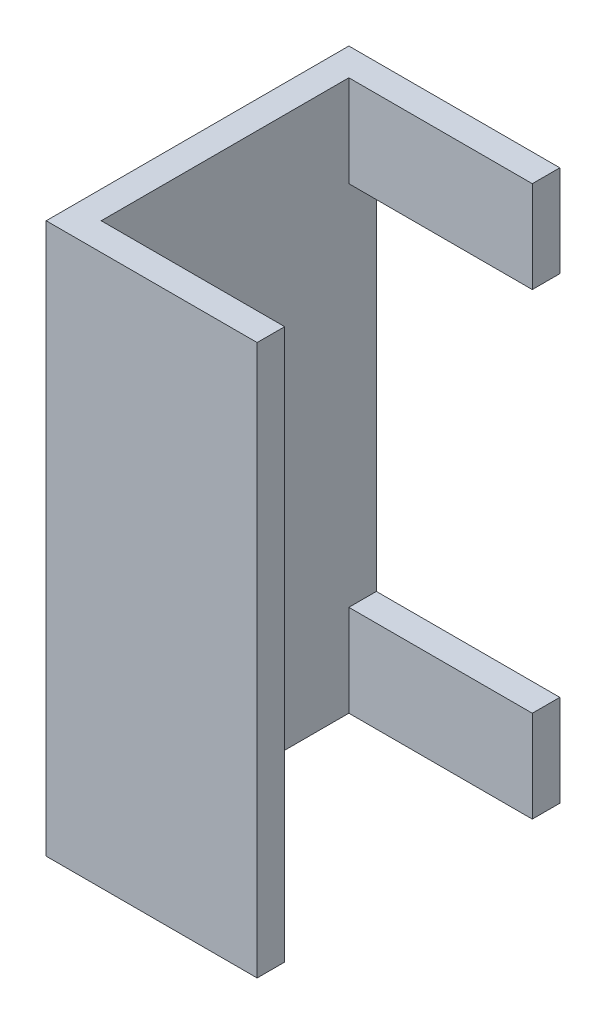
ISO-10303-21;
HEADER;
FILE_DESCRIPTION(('STEP AP214'),'2;1');
FILE_NAME('part.step','',(''),(''),'','','');
FILE_SCHEMA(('AUTOMOTIVE_DESIGN { 1 0 10303 214 1 1 1 1 }'));
ENDSEC;
DATA;
#1=APPLICATION_CONTEXT('core data for automotive mechanical design processes');
#2=APPLICATION_PROTOCOL_DEFINITION('international standard','automotive_design',2000,#1);
#3=PRODUCT_CONTEXT('',#1,'mechanical');
#4=PRODUCT('Part','Part','',(#3));
#5=PRODUCT_RELATED_PRODUCT_CATEGORY('part','',(#4));
#6=PRODUCT_DEFINITION_FORMATION('','',#4);
#7=PRODUCT_DEFINITION_CONTEXT('part definition',#1,'design');
#8=PRODUCT_DEFINITION('design','',#6,#7);
#9=PRODUCT_DEFINITION_SHAPE('','',#8);
#10=(LENGTH_UNIT() NAMED_UNIT(*) SI_UNIT(.MILLI.,.METRE.));
#11=(NAMED_UNIT(*) PLANE_ANGLE_UNIT() SI_UNIT($,.RADIAN.));
#12=(NAMED_UNIT(*) SI_UNIT($,.STERADIAN.) SOLID_ANGLE_UNIT());
#13=UNCERTAINTY_MEASURE_WITH_UNIT(LENGTH_MEASURE(1.E-05),#10,'distance_accuracy_value','');
#14=(GEOMETRIC_REPRESENTATION_CONTEXT(3) GLOBAL_UNCERTAINTY_ASSIGNED_CONTEXT((#13)) GLOBAL_UNIT_ASSIGNED_CONTEXT((#10,
#11,#12)) REPRESENTATION_CONTEXT('',''));
#15=CARTESIAN_POINT('',(0.,0.,0.));
#16=DIRECTION('',(0.,0.,1.));
#17=DIRECTION('',(1.,0.,0.));
#18=AXIS2_PLACEMENT_3D('',#15,#16,#17);
#19=CARTESIAN_POINT('',(-41.0585778341793,-41.0218663170366,36.));
#20=DIRECTION('',(1.,0.,0.));
#21=DIRECTION('',(0.,1.,0.));
#22=AXIS2_PLACEMENT_3D('',#19,#20,#21);
#23=PLANE('',#22);
#24=DIRECTION('',(0.,0.,1.));
#25=VECTOR('',#24,1.);
#26=CARTESIAN_POINT('',(-41.0585778341793,39.1000012156805,3.));
#27=LINE('',#26,#25);
#28=CARTESIAN_POINT('',(-41.0585778341793,39.1000012156805,3.));
#29=VERTEX_POINT('',#28);
#30=CARTESIAN_POINT('',(-41.0585778341793,39.1000012156805,30.));
#31=VERTEX_POINT('',#30);
#32=EDGE_CURVE('E56',#29,#31,#27,.T.);
#33=ORIENTED_EDGE('',*,*,#32,.T.);
#34=DIRECTION('',(0.,1.,0.));
#35=VECTOR('',#34,1.);
#36=CARTESIAN_POINT('',(-41.0585778341794,39.1000012156805,30.));
#37=LINE('',#36,#35);
#38=CARTESIAN_POINT('',(-41.0585778341793,-20.8999987843195,30.));
#39=VERTEX_POINT('',#38);
#40=EDGE_CURVE('E149',#39,#31,#37,.T.);
#41=ORIENTED_EDGE('',*,*,#40,.F.);
#42=DIRECTION('',(0.,0.,1.));
#43=VECTOR('',#42,1.);
#44=CARTESIAN_POINT('',(-41.0585778341793,-20.8999987843195,3.));
#45=LINE('',#44,#43);
#46=CARTESIAN_POINT('',(-41.0585778341793,-20.8999987843195,3.));
#47=VERTEX_POINT('',#46);
#48=EDGE_CURVE('E163',#47,#39,#45,.T.);
#49=ORIENTED_EDGE('',*,*,#48,.F.);
#50=DIRECTION('',(0.,-1.,0.));
#51=VECTOR('',#50,1.);
#52=CARTESIAN_POINT('',(-41.0585778341793,-10.8999987843195,3.));
#53=LINE('',#52,#51);
#54=CARTESIAN_POINT('',(-41.0585778341793,-10.8999987843195,3.));
#55=VERTEX_POINT('',#54);
#56=EDGE_CURVE('E153',#55,#47,#53,.T.);
#57=ORIENTED_EDGE('',*,*,#56,.F.);
#58=DIRECTION('',(0.,0.,-1.));
#59=VECTOR('',#58,1.);
#60=CARTESIAN_POINT('',(-41.0585778341793,-10.8999987843195,36.));
#61=LINE('',#60,#59);
#62=CARTESIAN_POINT('',(-41.0585778341793,-10.8999987843195,0.));
#63=VERTEX_POINT('',#62);
#64=EDGE_CURVE('E11',#55,#63,#61,.T.);
#65=ORIENTED_EDGE('',*,*,#64,.T.);
#66=DIRECTION('',(0.,-1.,0.));
#67=VECTOR('',#66,1.);
#68=CARTESIAN_POINT('',(-41.0585778341793,-41.0218663170366,0.));
#69=LINE('',#68,#67);
#70=CARTESIAN_POINT('',(-41.0585778341793,29.1000012156805,0.));
#71=VERTEX_POINT('',#70);
#72=EDGE_CURVE('E179',#71,#63,#69,.T.);
#73=ORIENTED_EDGE('',*,*,#72,.F.);
#74=DIRECTION('',(0.,0.,-1.));
#75=VECTOR('',#74,1.);
#76=CARTESIAN_POINT('',(-41.0585778341793,29.1000012156805,36.));
#77=LINE('',#76,#75);
#78=CARTESIAN_POINT('',(-41.0585778341793,29.1000012156805,3.));
#79=VERTEX_POINT('',#78);
#80=EDGE_CURVE('E41',#79,#71,#77,.T.);
#81=ORIENTED_EDGE('',*,*,#80,.F.);
#82=DIRECTION('',(0.,-1.,0.));
#83=VECTOR('',#82,1.);
#84=CARTESIAN_POINT('',(-41.0585778341793,39.1000012156805,3.));
#85=LINE('',#84,#83);
#86=EDGE_CURVE('E171',#29,#79,#85,.T.);
#87=ORIENTED_EDGE('',*,*,#86,.F.);
#88=EDGE_LOOP('',(#33,#41,#49,#57,#65,#73,#81,#87));
#89=FACE_BOUND('',#88,.T.);
#90=ADVANCED_FACE('F33',(#89),#23,.T.);
#91=CARTESIAN_POINT('',(-32.5585778341793,-10.8999987843195,36.));
#92=DIRECTION('',(0.,1.,0.));
#93=DIRECTION('',(-1.,0.,0.));
#94=AXIS2_PLACEMENT_3D('',#91,#92,#93);
#95=PLANE('',#94);
#96=ORIENTED_EDGE('',*,*,#64,.F.);
#97=DIRECTION('',(-1.,0.,0.));
#98=VECTOR('',#97,1.);
#99=CARTESIAN_POINT('',(-41.0585778341793,-10.8999987843195,3.));
#100=LINE('',#99,#98);
#101=CARTESIAN_POINT('',(-21.0585778341793,-10.8999987843195,3.));
#102=VERTEX_POINT('',#101);
#103=EDGE_CURVE('E160',#102,#55,#100,.T.);
#104=ORIENTED_EDGE('',*,*,#103,.F.);
#105=DIRECTION('',(0.,0.,-1.));
#106=VECTOR('',#105,1.);
#107=CARTESIAN_POINT('',(-21.0585778341793,-10.8999987843195,36.));
#108=LINE('',#107,#106);
#109=CARTESIAN_POINT('',(-21.0585778341793,-10.8999987843195,0.));
#110=VERTEX_POINT('',#109);
#111=EDGE_CURVE('E198',#102,#110,#108,.T.);
#112=ORIENTED_EDGE('',*,*,#111,.T.);
#113=DIRECTION('',(1.,0.,0.));
#114=VECTOR('',#113,1.);
#115=CARTESIAN_POINT('',(-32.5585778341793,-10.8999987843195,0.));
#116=LINE('',#115,#114);
#117=EDGE_CURVE('E176',#63,#110,#116,.T.);
#118=ORIENTED_EDGE('',*,*,#117,.F.);
#119=EDGE_LOOP('',(#96,#104,#112,#118));
#120=FACE_BOUND('',#119,.T.);
#121=ADVANCED_FACE('F35',(#120),#95,.T.);
#122=CARTESIAN_POINT('',(-21.0585778341793,-41.0218663170366,36.));
#123=DIRECTION('',(1.,0.,0.));
#124=DIRECTION('',(0.,1.,0.));
#125=AXIS2_PLACEMENT_3D('',#122,#123,#124);
#126=PLANE('',#125);
#127=ORIENTED_EDGE('',*,*,#111,.F.);
#128=DIRECTION('',(0.,1.,0.));
#129=VECTOR('',#128,1.);
#130=CARTESIAN_POINT('',(-21.0585778341793,-10.8999987843195,3.));
#131=LINE('',#130,#129);
#132=CARTESIAN_POINT('',(-21.0585778341793,-20.8999987843195,3.));
#133=VERTEX_POINT('',#132);
#134=EDGE_CURVE('E158',#133,#102,#131,.T.);
#135=ORIENTED_EDGE('',*,*,#134,.F.);
#136=DIRECTION('',(0.,0.,-1.));
#137=VECTOR('',#136,1.);
#138=CARTESIAN_POINT('',(-21.0585778341793,-20.8999987843195,36.));
#139=LINE('',#138,#137);
#140=CARTESIAN_POINT('',(-21.0585778341793,-20.8999987843195,0.));
#141=VERTEX_POINT('',#140);
#142=EDGE_CURVE('E200',#133,#141,#139,.T.);
#143=ORIENTED_EDGE('',*,*,#142,.T.);
#144=DIRECTION('',(0.,-1.,0.));
#145=VECTOR('',#144,1.);
#146=CARTESIAN_POINT('',(-21.0585778341793,-41.0218663170366,0.));
#147=LINE('',#146,#145);
#148=EDGE_CURVE('E189',#110,#141,#147,.T.);
#149=ORIENTED_EDGE('',*,*,#148,.F.);
#150=EDGE_LOOP('',(#127,#135,#143,#149));
#151=FACE_BOUND('',#150,.T.);
#152=ADVANCED_FACE('F227',(#151),#126,.T.);
#153=CARTESIAN_POINT('',(-32.5585778341793,29.1000012156805,36.));
#154=DIRECTION('',(0.,1.,0.));
#155=DIRECTION('',(0.,0.,1.));
#156=AXIS2_PLACEMENT_3D('',#153,#154,#155);
#157=PLANE('',#156);
#158=DIRECTION('',(0.,0.,-1.));
#159=VECTOR('',#158,1.);
#160=CARTESIAN_POINT('',(-21.0585778341794,29.1000012156805,36.));
#161=LINE('',#160,#159);
#162=CARTESIAN_POINT('',(-21.0585778341794,29.1000012156805,3.));
#163=VERTEX_POINT('',#162);
#164=CARTESIAN_POINT('',(-21.0585778341794,29.1000012156805,0.));
#165=VERTEX_POINT('',#164);
#166=EDGE_CURVE('E207',#163,#165,#161,.T.);
#167=ORIENTED_EDGE('',*,*,#166,.F.);
#168=DIRECTION('',(1.,0.,0.));
#169=VECTOR('',#168,1.);
#170=CARTESIAN_POINT('',(-21.0585778341794,29.1000012156805,3.));
#171=LINE('',#170,#169);
#172=EDGE_CURVE('E173',#79,#163,#171,.T.);
#173=ORIENTED_EDGE('',*,*,#172,.F.);
#174=ORIENTED_EDGE('',*,*,#80,.T.);
#175=DIRECTION('',(1.,0.,0.));
#176=VECTOR('',#175,1.);
#177=CARTESIAN_POINT('',(-32.5585778341793,29.1000012156805,0.));
#178=LINE('',#177,#176);
#179=EDGE_CURVE('E182',#71,#165,#178,.T.);
#180=ORIENTED_EDGE('',*,*,#179,.T.);
#181=EDGE_LOOP('',(#167,#173,#174,#180));
#182=FACE_BOUND('',#181,.T.);
#183=ADVANCED_FACE('F213',(#182),#157,.F.);
#184=DIRECTION('',(0.,1.,0.));
#185=VECTOR('',#184,1.);
#186=CARTESIAN_POINT('',(-21.0585778341794,39.1000012156805,3.));
#187=LINE('',#186,#185);
#188=CARTESIAN_POINT('',(-21.0585778341794,39.1000012156805,3.));
#189=VERTEX_POINT('',#188);
#190=EDGE_CURVE('E166',#163,#189,#187,.T.);
#191=ORIENTED_EDGE('',*,*,#190,.F.);
#192=ORIENTED_EDGE('',*,*,#166,.T.);
#193=CARTESIAN_POINT('',(-21.0585778341794,39.1000012156805,0.));
#194=VERTEX_POINT('',#193);
#195=EDGE_CURVE('E185',#194,#165,#147,.T.);
#196=ORIENTED_EDGE('',*,*,#195,.F.);
#197=DIRECTION('',(0.,0.,-1.));
#198=VECTOR('',#197,1.);
#199=CARTESIAN_POINT('',(-21.0585778341794,39.1000012156805,36.));
#200=LINE('',#199,#198);
#201=EDGE_CURVE('E205',#189,#194,#200,.T.);
#202=ORIENTED_EDGE('',*,*,#201,.F.);
#203=EDGE_LOOP('',(#191,#192,#196,#202));
#204=FACE_BOUND('',#203,.T.);
#205=ADVANCED_FACE('F240',(#204),#126,.T.);
#206=CARTESIAN_POINT('',(-32.5585778341793,39.1000012156805,36.));
#207=DIRECTION('',(0.,1.,0.));
#208=DIRECTION('',(0.,0.,1.));
#209=AXIS2_PLACEMENT_3D('',#206,#207,#208);
#210=PLANE('',#209);
#211=DIRECTION('',(1.,0.,0.));
#212=VECTOR('',#211,1.);
#213=CARTESIAN_POINT('',(-71.0585778341793,39.1000012156805,33.));
#214=LINE('',#213,#212);
#215=CARTESIAN_POINT('',(-44.0585778341793,39.1000012156805,33.));
#216=VERTEX_POINT('',#215);
#217=CARTESIAN_POINT('',(-21.0585778341793,39.1000012156805,33.));
#218=VERTEX_POINT('',#217);
#219=EDGE_CURVE('E121',#216,#218,#214,.T.);
#220=ORIENTED_EDGE('',*,*,#219,.T.);
#221=DIRECTION('',(0.,0.,1.));
#222=VECTOR('',#221,1.);
#223=CARTESIAN_POINT('',(-21.0585778341793,39.1000012156805,36.));
#224=LINE('',#223,#222);
#225=CARTESIAN_POINT('',(-21.0585778341793,39.1000012156805,30.));
#226=VERTEX_POINT('',#225);
#227=EDGE_CURVE('E132',#226,#218,#224,.T.);
#228=ORIENTED_EDGE('',*,*,#227,.F.);
#229=DIRECTION('',(-1.,0.,0.));
#230=VECTOR('',#229,1.);
#231=CARTESIAN_POINT('',(-21.0585778341793,39.1000012156805,30.));
#232=LINE('',#231,#230);
#233=EDGE_CURVE('E141',#226,#31,#232,.T.);
#234=ORIENTED_EDGE('',*,*,#233,.T.);
#235=ORIENTED_EDGE('',*,*,#32,.F.);
#236=DIRECTION('',(-1.,0.,0.));
#237=VECTOR('',#236,1.);
#238=CARTESIAN_POINT('',(-21.0585778341794,39.1000012156805,3.));
#239=LINE('',#238,#237);
#240=EDGE_CURVE('E168',#189,#29,#239,.T.);
#241=ORIENTED_EDGE('',*,*,#240,.F.);
#242=ORIENTED_EDGE('',*,*,#201,.T.);
#243=DIRECTION('',(1.,0.,0.));
#244=VECTOR('',#243,1.);
#245=CARTESIAN_POINT('',(-32.5585778341793,39.1000012156805,0.));
#246=LINE('',#245,#244);
#247=CARTESIAN_POINT('',(-44.0585778341794,39.1000012156805,0.));
#248=VERTEX_POINT('',#247);
#249=EDGE_CURVE('E188',#248,#194,#246,.T.);
#250=ORIENTED_EDGE('',*,*,#249,.F.);
#251=DIRECTION('',(0.,0.,-1.));
#252=VECTOR('',#251,1.);
#253=CARTESIAN_POINT('',(-44.0585778341794,39.1000012156805,36.));
#254=LINE('',#253,#252);
#255=EDGE_CURVE('E134',#216,#248,#254,.T.);
#256=ORIENTED_EDGE('',*,*,#255,.F.);
#257=EDGE_LOOP('',(#220,#228,#234,#235,#241,#242,#250,#256));
#258=FACE_BOUND('',#257,.T.);
#259=ADVANCED_FACE('F130',(#258),#210,.T.);
#260=CARTESIAN_POINT('',(-44.0585778341793,-41.0218663170366,36.));
#261=DIRECTION('',(1.,0.,0.));
#262=DIRECTION('',(0.,1.,0.));
#263=AXIS2_PLACEMENT_3D('',#260,#261,#262);
#264=PLANE('',#263);
#265=DIRECTION('',(0.,0.,-1.));
#266=VECTOR('',#265,1.);
#267=CARTESIAN_POINT('',(-44.0585778341793,-20.8999987843195,36.));
#268=LINE('',#267,#266);
#269=CARTESIAN_POINT('',(-44.0585778341793,-20.8999987843195,33.));
#270=VERTEX_POINT('',#269);
#271=CARTESIAN_POINT('',(-44.0585778341793,-20.8999987843195,0.));
#272=VERTEX_POINT('',#271);
#273=EDGE_CURVE('E202',#270,#272,#268,.T.);
#274=ORIENTED_EDGE('',*,*,#273,.F.);
#275=DIRECTION('',(0.,1.,0.));
#276=VECTOR('',#275,1.);
#277=CARTESIAN_POINT('',(-44.0585778341793,-41.0218663170366,33.));
#278=LINE('',#277,#276);
#279=EDGE_CURVE('E135',#270,#216,#278,.T.);
#280=ORIENTED_EDGE('',*,*,#279,.T.);
#281=ORIENTED_EDGE('',*,*,#255,.T.);
#282=DIRECTION('',(0.,-1.,0.));
#283=VECTOR('',#282,1.);
#284=CARTESIAN_POINT('',(-44.0585778341793,-41.0218663170366,0.));
#285=LINE('',#284,#283);
#286=EDGE_CURVE('E192',#248,#272,#285,.T.);
#287=ORIENTED_EDGE('',*,*,#286,.T.);
#288=EDGE_LOOP('',(#274,#280,#281,#287));
#289=FACE_BOUND('',#288,.T.);
#290=ADVANCED_FACE('F265',(#289),#264,.F.);
#291=CARTESIAN_POINT('',(-32.5585778341793,-20.8999987843195,36.));
#292=DIRECTION('',(0.,1.,0.));
#293=DIRECTION('',(0.,0.,1.));
#294=AXIS2_PLACEMENT_3D('',#291,#292,#293);
#295=PLANE('',#294);
#296=DIRECTION('',(0.,0.,-1.));
#297=VECTOR('',#296,1.);
#298=CARTESIAN_POINT('',(-21.0585778341793,-20.8999987843195,36.));
#299=LINE('',#298,#297);
#300=CARTESIAN_POINT('',(-21.0585778341793,-20.8999987843195,33.));
#301=VERTEX_POINT('',#300);
#302=CARTESIAN_POINT('',(-21.0585778341793,-20.8999987843195,30.));
#303=VERTEX_POINT('',#302);
#304=EDGE_CURVE('E145',#301,#303,#299,.T.);
#305=ORIENTED_EDGE('',*,*,#304,.F.);
#306=DIRECTION('',(1.,0.,0.));
#307=VECTOR('',#306,1.);
#308=CARTESIAN_POINT('',(-71.0585778341793,-20.8999987843195,33.));
#309=LINE('',#308,#307);
#310=EDGE_CURVE('E48',#270,#301,#309,.T.);
#311=ORIENTED_EDGE('',*,*,#310,.F.);
#312=ORIENTED_EDGE('',*,*,#273,.T.);
#313=DIRECTION('',(1.,0.,0.));
#314=VECTOR('',#313,1.);
#315=CARTESIAN_POINT('',(-32.5585778341793,-20.8999987843195,0.));
#316=LINE('',#315,#314);
#317=EDGE_CURVE('E195',#272,#141,#316,.T.);
#318=ORIENTED_EDGE('',*,*,#317,.T.);
#319=ORIENTED_EDGE('',*,*,#142,.F.);
#320=DIRECTION('',(1.,0.,0.));
#321=VECTOR('',#320,1.);
#322=CARTESIAN_POINT('',(-41.0585778341793,-20.8999987843195,3.));
#323=LINE('',#322,#321);
#324=EDGE_CURVE('E156',#47,#133,#323,.T.);
#325=ORIENTED_EDGE('',*,*,#324,.F.);
#326=ORIENTED_EDGE('',*,*,#48,.T.);
#327=DIRECTION('',(-1.,0.,0.));
#328=VECTOR('',#327,1.);
#329=CARTESIAN_POINT('',(-21.0585778341793,-20.8999987843195,30.));
#330=LINE('',#329,#328);
#331=EDGE_CURVE('E143',#303,#39,#330,.T.);
#332=ORIENTED_EDGE('',*,*,#331,.F.);
#333=EDGE_LOOP('',(#305,#311,#312,#318,#319,#325,#326,#332));
#334=FACE_BOUND('',#333,.T.);
#335=ADVANCED_FACE('F232',(#334),#295,.F.);
#336=CARTESIAN_POINT('',(-32.5585778341793,-41.0218663170366,0.));
#337=DIRECTION('',(0.,0.,1.));
#338=DIRECTION('',(1.,0.,0.));
#339=AXIS2_PLACEMENT_3D('',#336,#337,#338);
#340=PLANE('',#339);
#341=ORIENTED_EDGE('',*,*,#117,.T.);
#342=ORIENTED_EDGE('',*,*,#148,.T.);
#343=ORIENTED_EDGE('',*,*,#317,.F.);
#344=ORIENTED_EDGE('',*,*,#286,.F.);
#345=ORIENTED_EDGE('',*,*,#249,.T.);
#346=ORIENTED_EDGE('',*,*,#195,.T.);
#347=ORIENTED_EDGE('',*,*,#179,.F.);
#348=ORIENTED_EDGE('',*,*,#72,.T.);
#349=EDGE_LOOP('',(#341,#342,#343,#344,#345,#346,#347,#348));
#350=FACE_BOUND('',#349,.T.);
#351=ADVANCED_FACE('F216',(#350),#340,.F.);
#352=CARTESIAN_POINT('',(-21.0585778341794,29.1000012156805,3.));
#353=DIRECTION('',(0.,0.,-1.));
#354=DIRECTION('',(-1.,0.,0.));
#355=AXIS2_PLACEMENT_3D('',#352,#353,#354);
#356=PLANE('',#355);
#357=ORIENTED_EDGE('',*,*,#190,.T.);
#358=ORIENTED_EDGE('',*,*,#240,.T.);
#359=ORIENTED_EDGE('',*,*,#86,.T.);
#360=ORIENTED_EDGE('',*,*,#172,.T.);
#361=EDGE_LOOP('',(#357,#358,#359,#360));
#362=FACE_BOUND('',#361,.T.);
#363=ADVANCED_FACE('F242',(#362),#356,.F.);
#364=CARTESIAN_POINT('',(-41.0585778341793,-20.8999987843195,3.));
#365=DIRECTION('',(0.,0.,1.));
#366=DIRECTION('',(1.,0.,0.));
#367=AXIS2_PLACEMENT_3D('',#364,#365,#366);
#368=PLANE('',#367);
#369=ORIENTED_EDGE('',*,*,#56,.T.);
#370=ORIENTED_EDGE('',*,*,#324,.T.);
#371=ORIENTED_EDGE('',*,*,#134,.T.);
#372=ORIENTED_EDGE('',*,*,#103,.T.);
#373=EDGE_LOOP('',(#369,#370,#371,#372));
#374=FACE_BOUND('',#373,.T.);
#375=ADVANCED_FACE('F247',(#374),#368,.T.);
#376=CARTESIAN_POINT('',(-21.0585778341793,39.1000012156805,30.));
#377=DIRECTION('',(0.,0.,1.));
#378=DIRECTION('',(0.,-1.,0.));
#379=AXIS2_PLACEMENT_3D('',#376,#377,#378);
#380=PLANE('',#379);
#381=ORIENTED_EDGE('',*,*,#40,.T.);
#382=ORIENTED_EDGE('',*,*,#233,.F.);
#383=DIRECTION('',(0.,1.,0.));
#384=VECTOR('',#383,1.);
#385=CARTESIAN_POINT('',(-21.0585778341793,39.1000012156805,30.));
#386=LINE('',#385,#384);
#387=EDGE_CURVE('E139',#303,#226,#386,.T.);
#388=ORIENTED_EDGE('',*,*,#387,.F.);
#389=ORIENTED_EDGE('',*,*,#331,.T.);
#390=EDGE_LOOP('',(#381,#382,#388,#389));
#391=FACE_BOUND('',#390,.T.);
#392=ADVANCED_FACE('F244',(#391),#380,.F.);
#393=CARTESIAN_POINT('',(-21.0585778341793,-20.8999987843195,36.));
#394=DIRECTION('',(1.,0.,0.));
#395=DIRECTION('',(0.,1.,0.));
#396=AXIS2_PLACEMENT_3D('',#393,#394,#395);
#397=PLANE('',#396);
#398=DIRECTION('',(0.,1.,0.));
#399=VECTOR('',#398,1.);
#400=CARTESIAN_POINT('',(-21.0585778341793,39.1000012156805,33.));
#401=LINE('',#400,#399);
#402=EDGE_CURVE('E118',#301,#218,#401,.T.);
#403=ORIENTED_EDGE('',*,*,#402,.F.);
#404=ORIENTED_EDGE('',*,*,#304,.T.);
#405=ORIENTED_EDGE('',*,*,#387,.T.);
#406=ORIENTED_EDGE('',*,*,#227,.T.);
#407=EDGE_LOOP('',(#403,#404,#405,#406));
#408=FACE_BOUND('',#407,.T.);
#409=ADVANCED_FACE('F137',(#408),#397,.T.);
#410=CARTESIAN_POINT('',(-71.0585778341793,39.1000012156805,33.));
#411=DIRECTION('',(0.,0.,-1.));
#412=DIRECTION('',(-1.,0.,0.));
#413=AXIS2_PLACEMENT_3D('',#410,#411,#412);
#414=PLANE('',#413);
#415=ORIENTED_EDGE('',*,*,#310,.T.);
#416=ORIENTED_EDGE('',*,*,#402,.T.);
#417=ORIENTED_EDGE('',*,*,#219,.F.);
#418=ORIENTED_EDGE('',*,*,#279,.F.);
#419=EDGE_LOOP('',(#415,#416,#417,#418));
#420=FACE_BOUND('',#419,.T.);
#421=ADVANCED_FACE('F120',(#420),#414,.F.);
#422=CLOSED_SHELL('',(#90,#121,#152,#183,#205,#259,#290,#335,#351,#363,#375,#392,#409,#421));
#423=MANIFOLD_SOLID_BREP('B2',#422);
#424=ADVANCED_BREP_SHAPE_REPRESENTATION('',(#18,#423),#14);
#425=SHAPE_DEFINITION_REPRESENTATION(#9,#424);
ENDSEC;
END-ISO-10303-21;
